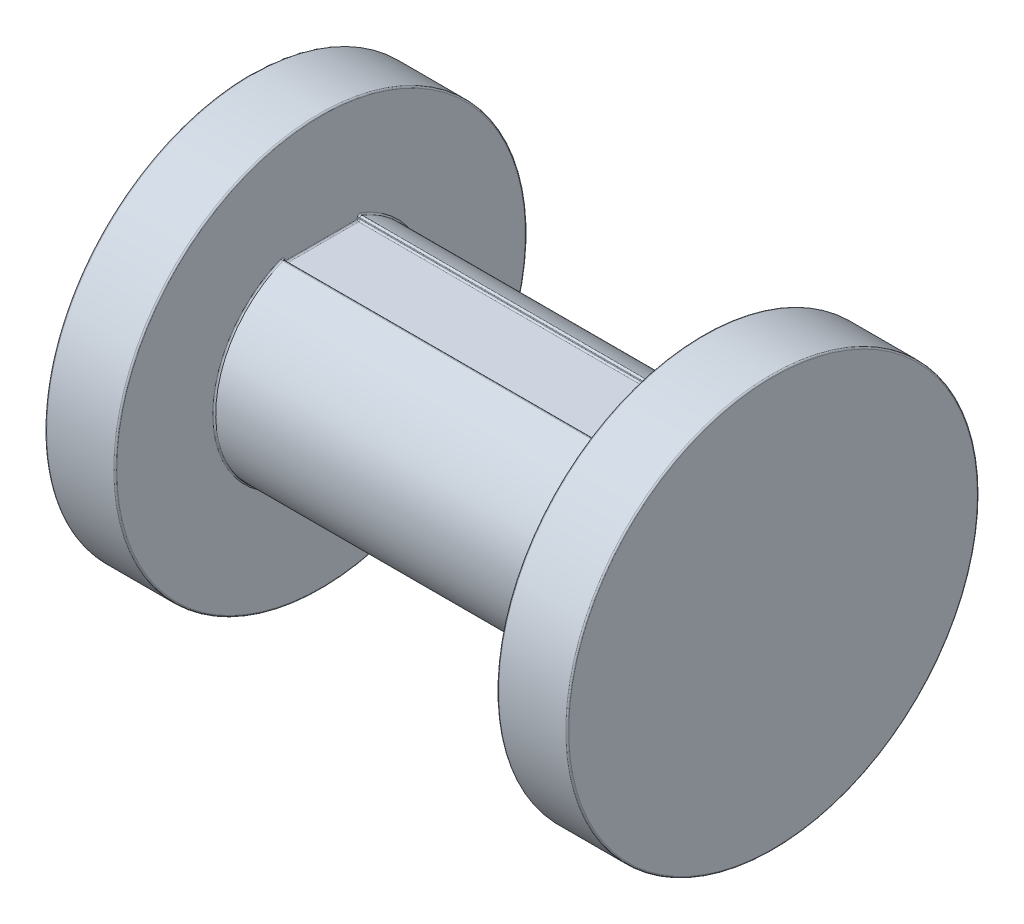
ISO-10303-21;
HEADER;
FILE_DESCRIPTION(('STEP AP214'),'2;1');
FILE_NAME('part.step','',(''),(''),'','','');
FILE_SCHEMA(('AUTOMOTIVE_DESIGN { 1 0 10303 214 1 1 1 1 }'));
ENDSEC;
DATA;
#1=APPLICATION_CONTEXT('core data for automotive mechanical design processes');
#2=APPLICATION_PROTOCOL_DEFINITION('international standard','automotive_design',2000,#1);
#3=PRODUCT_CONTEXT('',#1,'mechanical');
#4=PRODUCT('Part','Part','',(#3));
#5=PRODUCT_RELATED_PRODUCT_CATEGORY('part','',(#4));
#6=PRODUCT_DEFINITION_FORMATION('','',#4);
#7=PRODUCT_DEFINITION_CONTEXT('part definition',#1,'design');
#8=PRODUCT_DEFINITION('design','',#6,#7);
#9=PRODUCT_DEFINITION_SHAPE('','',#8);
#10=(LENGTH_UNIT() NAMED_UNIT(*) SI_UNIT(.MILLI.,.METRE.));
#11=(NAMED_UNIT(*) PLANE_ANGLE_UNIT() SI_UNIT($,.RADIAN.));
#12=(NAMED_UNIT(*) SI_UNIT($,.STERADIAN.) SOLID_ANGLE_UNIT());
#13=UNCERTAINTY_MEASURE_WITH_UNIT(LENGTH_MEASURE(1.E-05),#10,'distance_accuracy_value','');
#14=(GEOMETRIC_REPRESENTATION_CONTEXT(3) GLOBAL_UNCERTAINTY_ASSIGNED_CONTEXT((#13)) GLOBAL_UNIT_ASSIGNED_CONTEXT((#10,
#11,#12)) REPRESENTATION_CONTEXT('',''));
#15=CARTESIAN_POINT('',(0.,0.,0.));
#16=DIRECTION('',(0.,0.,1.));
#17=DIRECTION('',(1.,0.,0.));
#18=AXIS2_PLACEMENT_3D('',#15,#16,#17);
#19=CARTESIAN_POINT('',(53.02,0.,0.));
#20=DIRECTION('',(-1.,0.,0.));
#21=DIRECTION('',(0.,0.,1.));
#22=AXIS2_PLACEMENT_3D('',#19,#20,#21);
#23=CYLINDRICAL_SURFACE('',#22,21.7);
#24=DIRECTION('',(-1.,0.,0.));
#25=VECTOR('',#24,1.);
#26=CARTESIAN_POINT('',(53.02,20.1551386397743,-8.04116822429906));
#27=LINE('',#26,#25);
#28=CARTESIAN_POINT('',(-38.48,20.1551386397743,-8.04116822429907));
#29=VERTEX_POINT('',#28);
#30=CARTESIAN_POINT('',(38.48,20.1551386397743,-8.04116822429907));
#31=VERTEX_POINT('',#30);
#32=EDGE_CURVE('E68',#29,#31,#27,.F.);
#33=ORIENTED_EDGE('',*,*,#32,.T.);
#34=CARTESIAN_POINT('',(38.48,0.,0.));
#35=DIRECTION('',(1.,0.,0.));
#36=DIRECTION('',(0.,0.,-1.));
#37=AXIS2_PLACEMENT_3D('',#34,#35,#36);
#38=CIRCLE('',#37,21.7);
#39=CARTESIAN_POINT('',(38.48,20.1551386397743,8.04116822429907));
#40=VERTEX_POINT('',#39);
#41=EDGE_CURVE('E63',#31,#40,#38,.F.);
#42=ORIENTED_EDGE('',*,*,#41,.T.);
#43=DIRECTION('',(-1.,0.,0.));
#44=VECTOR('',#43,1.);
#45=CARTESIAN_POINT('',(53.02,20.1551386397743,8.04116822429906));
#46=LINE('',#45,#44);
#47=CARTESIAN_POINT('',(-38.48,20.1551386397743,8.04116822429907));
#48=VERTEX_POINT('',#47);
#49=EDGE_CURVE('E259',#40,#48,#46,.T.);
#50=ORIENTED_EDGE('',*,*,#49,.T.);
#51=CARTESIAN_POINT('',(-38.48,0.,0.));
#52=DIRECTION('',(-1.,0.,0.));
#53=DIRECTION('',(0.,0.,1.));
#54=AXIS2_PLACEMENT_3D('',#51,#52,#53);
#55=CIRCLE('',#54,21.7);
#56=EDGE_CURVE('E254',#48,#29,#55,.F.);
#57=ORIENTED_EDGE('',*,*,#56,.T.);
#58=EDGE_LOOP('',(#33,#42,#50,#57));
#59=FACE_BOUND('',#58,.T.);
#60=ADVANCED_FACE('F45',(#59),#23,.T.);
#61=CARTESIAN_POINT('',(-53.02,19.3463818513003,-7.63));
#62=DIRECTION('',(0.,0.,-1.));
#63=DIRECTION('',(-1.,0.,0.));
#64=AXIS2_PLACEMENT_3D('',#61,#62,#63);
#65=PLANE('',#64);
#66=DIRECTION('',(0.,-1.,0.));
#67=VECTOR('',#66,1.);
#68=CARTESIAN_POINT('',(38.48,20.3143569920389,-7.63));
#69=LINE('',#68,#67);
#70=CARTESIAN_POINT('',(38.48,19.6463818513003,-7.63));
#71=VERTEX_POINT('',#70);
#72=CARTESIAN_POINT('',(38.48,19.8764961701,-7.63));
#73=VERTEX_POINT('',#72);
#74=EDGE_CURVE('E196',#71,#73,#69,.F.);
#75=ORIENTED_EDGE('',*,*,#74,.T.);
#76=DIRECTION('',(-1.,0.,0.));
#77=VECTOR('',#76,1.);
#78=CARTESIAN_POINT('',(-53.02,19.8764961701,-7.63));
#79=LINE('',#78,#77);
#80=CARTESIAN_POINT('',(-38.48,19.8764961701,-7.63));
#81=VERTEX_POINT('',#80);
#82=EDGE_CURVE('E200',#73,#81,#79,.T.);
#83=ORIENTED_EDGE('',*,*,#82,.T.);
#84=DIRECTION('',(0.,1.,0.));
#85=VECTOR('',#84,1.);
#86=CARTESIAN_POINT('',(-38.48,19.3463818513003,-7.63));
#87=LINE('',#86,#85);
#88=CARTESIAN_POINT('',(-38.48,19.6463818513003,-7.63));
#89=VERTEX_POINT('',#88);
#90=EDGE_CURVE('E193',#81,#89,#87,.F.);
#91=ORIENTED_EDGE('',*,*,#90,.T.);
#92=DIRECTION('',(1.,0.,0.));
#93=VECTOR('',#92,1.);
#94=CARTESIAN_POINT('',(38.78,19.6463818513003,-7.63));
#95=LINE('',#94,#93);
#96=EDGE_CURVE('E185',#89,#71,#95,.T.);
#97=ORIENTED_EDGE('',*,*,#96,.T.);
#98=EDGE_LOOP('',(#75,#83,#91,#97));
#99=FACE_BOUND('',#98,.T.);
#100=ADVANCED_FACE('F409',(#99),#65,.F.);
#101=CARTESIAN_POINT('',(-53.02,19.3463818513003,7.63));
#102=DIRECTION('',(0.,-1.,0.));
#103=DIRECTION('',(0.,0.,-1.));
#104=AXIS2_PLACEMENT_3D('',#101,#102,#103);
#105=PLANE('',#104);
#106=DIRECTION('',(1.,0.,0.));
#107=VECTOR('',#106,1.);
#108=CARTESIAN_POINT('',(-38.78,19.3463818513003,-7.33));
#109=LINE('',#108,#107);
#110=CARTESIAN_POINT('',(38.48,19.3463818513003,-7.33));
#111=VERTEX_POINT('',#110);
#112=CARTESIAN_POINT('',(-38.48,19.3463818513003,-7.33));
#113=VERTEX_POINT('',#112);
#114=EDGE_CURVE('E244',#111,#113,#109,.F.);
#115=ORIENTED_EDGE('',*,*,#114,.T.);
#116=DIRECTION('',(0.,0.,-1.));
#117=VECTOR('',#116,1.);
#118=CARTESIAN_POINT('',(-38.48,19.3463818513003,7.63));
#119=LINE('',#118,#117);
#120=CARTESIAN_POINT('',(-38.48,19.3463818513003,7.33));
#121=VERTEX_POINT('',#120);
#122=EDGE_CURVE('E250',#113,#121,#119,.F.);
#123=ORIENTED_EDGE('',*,*,#122,.T.);
#124=DIRECTION('',(1.,0.,0.));
#125=VECTOR('',#124,1.);
#126=CARTESIAN_POINT('',(38.78,19.3463818513003,7.33));
#127=LINE('',#126,#125);
#128=CARTESIAN_POINT('',(38.48,19.3463818513003,7.33));
#129=VERTEX_POINT('',#128);
#130=EDGE_CURVE('E247',#121,#129,#127,.T.);
#131=ORIENTED_EDGE('',*,*,#130,.T.);
#132=DIRECTION('',(0.,0.,1.));
#133=VECTOR('',#132,1.);
#134=CARTESIAN_POINT('',(38.48,19.3463818513003,-7.63));
#135=LINE('',#134,#133);
#136=EDGE_CURVE('E241',#129,#111,#135,.F.);
#137=ORIENTED_EDGE('',*,*,#136,.T.);
#138=EDGE_LOOP('',(#115,#123,#131,#137));
#139=FACE_BOUND('',#138,.T.);
#140=ADVANCED_FACE('F451',(#139),#105,.F.);
#141=CARTESIAN_POINT('',(-53.02,20.3143569920389,7.63));
#142=DIRECTION('',(0.,0.,1.));
#143=DIRECTION('',(1.,0.,0.));
#144=AXIS2_PLACEMENT_3D('',#141,#142,#143);
#145=PLANE('',#144);
#146=DIRECTION('',(0.,1.,0.));
#147=VECTOR('',#146,1.);
#148=CARTESIAN_POINT('',(38.48,19.3463818513003,7.63));
#149=LINE('',#148,#147);
#150=CARTESIAN_POINT('',(38.48,19.8764961701,7.63));
#151=VERTEX_POINT('',#150);
#152=CARTESIAN_POINT('',(38.48,19.6463818513003,7.63));
#153=VERTEX_POINT('',#152);
#154=EDGE_CURVE('E209',#151,#153,#149,.F.);
#155=ORIENTED_EDGE('',*,*,#154,.T.);
#156=DIRECTION('',(1.,0.,0.));
#157=VECTOR('',#156,1.);
#158=CARTESIAN_POINT('',(-38.78,19.6463818513003,7.63));
#159=LINE('',#158,#157);
#160=CARTESIAN_POINT('',(-38.48,19.6463818513003,7.63));
#161=VERTEX_POINT('',#160);
#162=EDGE_CURVE('E213',#153,#161,#159,.F.);
#163=ORIENTED_EDGE('',*,*,#162,.T.);
#164=DIRECTION('',(0.,-1.,0.));
#165=VECTOR('',#164,1.);
#166=CARTESIAN_POINT('',(-38.48,20.3143569920389,7.63));
#167=LINE('',#166,#165);
#168=CARTESIAN_POINT('',(-38.48,19.8764961701,7.63));
#169=VERTEX_POINT('',#168);
#170=EDGE_CURVE('E206',#161,#169,#167,.F.);
#171=ORIENTED_EDGE('',*,*,#170,.T.);
#172=DIRECTION('',(-1.,0.,0.));
#173=VECTOR('',#172,1.);
#174=CARTESIAN_POINT('',(-53.02,19.8764961701,7.63));
#175=LINE('',#174,#173);
#176=EDGE_CURVE('E203',#169,#151,#175,.F.);
#177=ORIENTED_EDGE('',*,*,#176,.T.);
#178=EDGE_LOOP('',(#155,#163,#171,#177));
#179=FACE_BOUND('',#178,.T.);
#180=ADVANCED_FACE('F425',(#179),#145,.F.);
#181=CARTESIAN_POINT('',(38.78,0.,0.));
#182=DIRECTION('',(1.,0.,0.));
#183=DIRECTION('',(0.,0.,-1.));
#184=AXIS2_PLACEMENT_3D('',#181,#182,#183);
#185=PLANE('',#184);
#186=DIRECTION('',(0.,-1.,0.));
#187=VECTOR('',#186,1.);
#188=CARTESIAN_POINT('',(38.78,19.3463818513003,-7.33));
#189=LINE('',#188,#187);
#190=CARTESIAN_POINT('',(38.78,19.8764961701,-7.33));
#191=VERTEX_POINT('',#190);
#192=CARTESIAN_POINT('',(38.78,19.6463818513003,-7.33));
#193=VERTEX_POINT('',#192);
#194=EDGE_CURVE('E153',#191,#193,#189,.T.);
#195=ORIENTED_EDGE('',*,*,#194,.T.);
#196=DIRECTION('',(0.,0.,1.));
#197=VECTOR('',#196,1.);
#198=CARTESIAN_POINT('',(38.78,19.6463818513003,7.63));
#199=LINE('',#198,#197);
#200=CARTESIAN_POINT('',(38.78,19.6463818513003,7.33));
#201=VERTEX_POINT('',#200);
#202=EDGE_CURVE('E178',#193,#201,#199,.T.);
#203=ORIENTED_EDGE('',*,*,#202,.T.);
#204=DIRECTION('',(0.,1.,0.));
#205=VECTOR('',#204,1.);
#206=CARTESIAN_POINT('',(38.78,20.3143569920389,7.33));
#207=LINE('',#206,#205);
#208=CARTESIAN_POINT('',(38.78,19.8764961701,7.33));
#209=VERTEX_POINT('',#208);
#210=EDGE_CURVE('E179',#201,#209,#207,.T.);
#211=ORIENTED_EDGE('',*,*,#210,.T.);
#212=CARTESIAN_POINT('',(38.78,19.8764961701,7.93));
#213=DIRECTION('',(1.,0.,0.));
#214=DIRECTION('',(0.,0.,-1.));
#215=AXIS2_PLACEMENT_3D('',#212,#213,#214);
#216=CIRCLE('',#215,0.6);
#217=CARTESIAN_POINT('',(38.78,20.4337811094486,8.15233644859813));
#218=VERTEX_POINT('',#217);
#219=EDGE_CURVE('E187',#218,#209,#216,.F.);
#220=ORIENTED_EDGE('',*,*,#219,.F.);
#221=CARTESIAN_POINT('',(38.78,0.,0.));
#222=DIRECTION('',(1.,0.,0.));
#223=DIRECTION('',(0.,0.,-1.));
#224=AXIS2_PLACEMENT_3D('',#221,#222,#223);
#225=CIRCLE('',#224,22.);
#226=CARTESIAN_POINT('',(38.78,20.4337811094486,-8.15233644859813));
#227=VERTEX_POINT('',#226);
#228=EDGE_CURVE('E155',#218,#227,#225,.T.);
#229=ORIENTED_EDGE('',*,*,#228,.T.);
#230=CARTESIAN_POINT('',(38.78,19.8764961701,-7.93));
#231=DIRECTION('',(1.,0.,0.));
#232=DIRECTION('',(0.,0.,-1.));
#233=AXIS2_PLACEMENT_3D('',#230,#231,#232);
#234=CIRCLE('',#233,0.6);
#235=EDGE_CURVE('E148',#191,#227,#234,.F.);
#236=ORIENTED_EDGE('',*,*,#235,.F.);
#237=EDGE_LOOP('',(#195,#203,#211,#220,#229,#236));
#238=FACE_BOUND('',#237,.T.);
#239=CARTESIAN_POINT('',(38.78,0.,0.));
#240=DIRECTION('',(1.,0.,0.));
#241=DIRECTION('',(0.,0.,-1.));
#242=AXIS2_PLACEMENT_3D('',#239,#240,#241);
#243=CIRCLE('',#242,41.5);
#244=CARTESIAN_POINT('',(38.78,0.,-41.5));
#245=VERTEX_POINT('',#244);
#246=EDGE_CURVE('E160',#245,#245,#243,.F.);
#247=ORIENTED_EDGE('',*,*,#246,.T.);
#248=EDGE_LOOP('',(#247));
#249=FACE_BOUND('',#248,.T.);
#250=ADVANCED_FACE('F150',(#238,#249),#185,.F.);
#251=CARTESIAN_POINT('',(38.78,0.,0.));
#252=DIRECTION('',(1.,0.,0.));
#253=DIRECTION('',(0.,0.,-1.));
#254=AXIS2_PLACEMENT_3D('',#251,#252,#253);
#255=CYLINDRICAL_SURFACE('',#254,41.8);
#256=CARTESIAN_POINT('',(39.08,0.,0.));
#257=DIRECTION('',(1.,0.,0.));
#258=DIRECTION('',(0.,0.,-1.));
#259=AXIS2_PLACEMENT_3D('',#256,#257,#258);
#260=CIRCLE('',#259,41.8);
#261=CARTESIAN_POINT('',(39.08,0.,-41.8));
#262=VERTEX_POINT('',#261);
#263=EDGE_CURVE('E268',#262,#262,#260,.T.);
#264=ORIENTED_EDGE('',*,*,#263,.T.);
#265=EDGE_LOOP('',(#264));
#266=FACE_BOUND('',#265,.T.);
#267=CARTESIAN_POINT('',(52.72,0.,0.));
#268=DIRECTION('',(1.,0.,0.));
#269=DIRECTION('',(0.,0.,-1.));
#270=AXIS2_PLACEMENT_3D('',#267,#268,#269);
#271=CIRCLE('',#270,41.8);
#272=CARTESIAN_POINT('',(52.72,0.,-41.8));
#273=VERTEX_POINT('',#272);
#274=EDGE_CURVE('E264',#273,#273,#271,.F.);
#275=ORIENTED_EDGE('',*,*,#274,.T.);
#276=EDGE_LOOP('',(#275));
#277=FACE_BOUND('',#276,.T.);
#278=ADVANCED_FACE('F782',(#266,#277),#255,.T.);
#279=CARTESIAN_POINT('',(53.02,0.,0.));
#280=DIRECTION('',(1.,0.,0.));
#281=DIRECTION('',(0.,0.,-1.));
#282=AXIS2_PLACEMENT_3D('',#279,#280,#281);
#283=PLANE('',#282);
#284=CARTESIAN_POINT('',(53.02,0.,0.));
#285=DIRECTION('',(1.,0.,0.));
#286=DIRECTION('',(0.,0.,-1.));
#287=AXIS2_PLACEMENT_3D('',#284,#285,#286);
#288=CIRCLE('',#287,41.5);
#289=CARTESIAN_POINT('',(53.02,0.,-41.5));
#290=VERTEX_POINT('',#289);
#291=EDGE_CURVE('E272',#290,#290,#288,.T.);
#292=ORIENTED_EDGE('',*,*,#291,.T.);
#293=EDGE_LOOP('',(#292));
#294=FACE_BOUND('',#293,.T.);
#295=ADVANCED_FACE('F739',(#294),#283,.T.);
#296=CARTESIAN_POINT('',(-38.78,0.,0.));
#297=DIRECTION('',(-1.,0.,0.));
#298=DIRECTION('',(0.,0.,-1.));
#299=AXIS2_PLACEMENT_3D('',#296,#297,#298);
#300=PLANE('',#299);
#301=CARTESIAN_POINT('',(-38.78,0.,0.));
#302=DIRECTION('',(-1.,0.,0.));
#303=DIRECTION('',(0.,0.,1.));
#304=AXIS2_PLACEMENT_3D('',#301,#302,#303);
#305=CIRCLE('',#304,41.5);
#306=CARTESIAN_POINT('',(-38.78,0.,41.5));
#307=VERTEX_POINT('',#306);
#308=EDGE_CURVE('E237',#307,#307,#305,.F.);
#309=ORIENTED_EDGE('',*,*,#308,.T.);
#310=EDGE_LOOP('',(#309));
#311=FACE_BOUND('',#310,.T.);
#312=DIRECTION('',(0.,-1.,0.));
#313=VECTOR('',#312,1.);
#314=CARTESIAN_POINT('',(-38.78,19.3463818513003,7.33));
#315=LINE('',#314,#313);
#316=CARTESIAN_POINT('',(-38.78,19.8764961701,7.33));
#317=VERTEX_POINT('',#316);
#318=CARTESIAN_POINT('',(-38.78,19.6463818513003,7.33));
#319=VERTEX_POINT('',#318);
#320=EDGE_CURVE('E230',#317,#319,#315,.T.);
#321=ORIENTED_EDGE('',*,*,#320,.T.);
#322=DIRECTION('',(0.,0.,-1.));
#323=VECTOR('',#322,1.);
#324=CARTESIAN_POINT('',(-38.78,19.6463818513003,-7.63));
#325=LINE('',#324,#323);
#326=CARTESIAN_POINT('',(-38.78,19.6463818513003,-7.33));
#327=VERTEX_POINT('',#326);
#328=EDGE_CURVE('E234',#319,#327,#325,.T.);
#329=ORIENTED_EDGE('',*,*,#328,.T.);
#330=DIRECTION('',(0.,1.,0.));
#331=VECTOR('',#330,1.);
#332=CARTESIAN_POINT('',(-38.78,20.3143569920389,-7.33));
#333=LINE('',#332,#331);
#334=CARTESIAN_POINT('',(-38.78,19.8764961701,-7.33));
#335=VERTEX_POINT('',#334);
#336=EDGE_CURVE('E227',#327,#335,#333,.T.);
#337=ORIENTED_EDGE('',*,*,#336,.T.);
#338=CARTESIAN_POINT('',(-38.78,19.8764961701,-7.93));
#339=DIRECTION('',(-1.,0.,0.));
#340=DIRECTION('',(0.,0.,1.));
#341=AXIS2_PLACEMENT_3D('',#338,#339,#340);
#342=CIRCLE('',#341,0.6);
#343=CARTESIAN_POINT('',(-38.78,20.4337811094486,-8.15233644859813));
#344=VERTEX_POINT('',#343);
#345=EDGE_CURVE('E223',#344,#335,#342,.F.);
#346=ORIENTED_EDGE('',*,*,#345,.F.);
#347=CARTESIAN_POINT('',(-38.78,0.,0.));
#348=DIRECTION('',(-1.,0.,0.));
#349=DIRECTION('',(0.,0.,1.));
#350=AXIS2_PLACEMENT_3D('',#347,#348,#349);
#351=CIRCLE('',#350,22.);
#352=CARTESIAN_POINT('',(-38.78,20.4337811094486,8.15233644859813));
#353=VERTEX_POINT('',#352);
#354=EDGE_CURVE('E220',#344,#353,#351,.T.);
#355=ORIENTED_EDGE('',*,*,#354,.T.);
#356=CARTESIAN_POINT('',(-38.78,19.8764961701,7.93));
#357=DIRECTION('',(-1.,0.,0.));
#358=DIRECTION('',(0.,0.,1.));
#359=AXIS2_PLACEMENT_3D('',#356,#357,#358);
#360=CIRCLE('',#359,0.6);
#361=EDGE_CURVE('E216',#317,#353,#360,.F.);
#362=ORIENTED_EDGE('',*,*,#361,.F.);
#363=EDGE_LOOP('',(#321,#329,#337,#346,#355,#362));
#364=FACE_BOUND('',#363,.T.);
#365=ADVANCED_FACE('F728',(#311,#364),#300,.F.);
#366=CARTESIAN_POINT('',(-38.78,0.,0.));
#367=DIRECTION('',(-1.,0.,0.));
#368=DIRECTION('',(0.,0.,1.));
#369=AXIS2_PLACEMENT_3D('',#366,#367,#368);
#370=CYLINDRICAL_SURFACE('',#369,41.8);
#371=CARTESIAN_POINT('',(-52.72,0.,0.));
#372=DIRECTION('',(1.,0.,0.));
#373=DIRECTION('',(0.,0.,-1.));
#374=AXIS2_PLACEMENT_3D('',#371,#372,#373);
#375=CIRCLE('',#374,41.8);
#376=CARTESIAN_POINT('',(-52.72,0.,-41.8));
#377=VERTEX_POINT('',#376);
#378=EDGE_CURVE('E55',#377,#377,#375,.T.);
#379=ORIENTED_EDGE('',*,*,#378,.T.);
#380=EDGE_LOOP('',(#379));
#381=FACE_BOUND('',#380,.T.);
#382=CARTESIAN_POINT('',(-39.08,0.,0.));
#383=DIRECTION('',(-1.,0.,0.));
#384=DIRECTION('',(0.,0.,1.));
#385=AXIS2_PLACEMENT_3D('',#382,#383,#384);
#386=CIRCLE('',#385,41.8);
#387=CARTESIAN_POINT('',(-39.08,0.,41.8));
#388=VERTEX_POINT('',#387);
#389=EDGE_CURVE('E276',#388,#388,#386,.T.);
#390=ORIENTED_EDGE('',*,*,#389,.T.);
#391=EDGE_LOOP('',(#390));
#392=FACE_BOUND('',#391,.T.);
#393=ADVANCED_FACE('F715',(#381,#392),#370,.T.);
#394=CARTESIAN_POINT('',(-53.02,0.,0.));
#395=DIRECTION('',(1.,0.,0.));
#396=DIRECTION('',(0.,0.,-1.));
#397=AXIS2_PLACEMENT_3D('',#394,#395,#396);
#398=PLANE('',#397);
#399=CARTESIAN_POINT('',(-53.02,0.,0.));
#400=DIRECTION('',(1.,0.,0.));
#401=DIRECTION('',(0.,0.,-1.));
#402=AXIS2_PLACEMENT_3D('',#399,#400,#401);
#403=CIRCLE('',#402,41.5);
#404=CARTESIAN_POINT('',(-53.02,0.,-41.5));
#405=VERTEX_POINT('',#404);
#406=EDGE_CURVE('E11',#405,#405,#403,.F.);
#407=ORIENTED_EDGE('',*,*,#406,.T.);
#408=EDGE_LOOP('',(#407));
#409=FACE_BOUND('',#408,.T.);
#410=ADVANCED_FACE('F471',(#409),#398,.F.);
#411=CARTESIAN_POINT('',(-38.48,0.,7.33));
#412=DIRECTION('',(0.,1.,0.));
#413=DIRECTION('',(0.,0.,1.));
#414=AXIS2_PLACEMENT_3D('',#411,#412,#413);
#415=CYLINDRICAL_SURFACE('',#414,0.3);
#416=CARTESIAN_POINT('',(-38.48,19.6463818513003,7.33));
#417=DIRECTION('',(0.,1.,0.));
#418=DIRECTION('',(0.,0.,1.));
#419=AXIS2_PLACEMENT_3D('',#416,#417,#418);
#420=CIRCLE('',#419,0.3);
#421=EDGE_CURVE('E358',#319,#161,#420,.T.);
#422=ORIENTED_EDGE('',*,*,#421,.F.);
#423=ORIENTED_EDGE('',*,*,#320,.F.);
#424=CARTESIAN_POINT('',(-38.48,19.8764961701,7.33));
#425=DIRECTION('',(0.,-1.,0.));
#426=DIRECTION('',(0.,0.,-1.));
#427=AXIS2_PLACEMENT_3D('',#424,#425,#426);
#428=CIRCLE('',#427,0.3);
#429=EDGE_CURVE('E49',#169,#317,#428,.T.);
#430=ORIENTED_EDGE('',*,*,#429,.F.);
#431=ORIENTED_EDGE('',*,*,#170,.F.);
#432=EDGE_LOOP('',(#422,#423,#430,#431));
#433=FACE_BOUND('',#432,.T.);
#434=ADVANCED_FACE('F427',(#433),#415,.F.);
#435=CARTESIAN_POINT('',(-38.48,19.8764961701,7.93));
#436=DIRECTION('',(-1.,0.,0.));
#437=DIRECTION('',(0.,0.,1.));
#438=AXIS2_PLACEMENT_3D('',#435,#436,#437);
#439=TOROIDAL_SURFACE('',#438,0.6,0.3);
#440=ORIENTED_EDGE('',*,*,#429,.T.);
#441=ORIENTED_EDGE('',*,*,#361,.T.);
#442=CARTESIAN_POINT('',(-38.48,20.4337811094486,8.15233644859813));
#443=DIRECTION('',(0.,-0.370560747663552,0.928808232247663));
#444=DIRECTION('',(0.,-0.928808232247663,-0.370560747663552));
#445=AXIS2_PLACEMENT_3D('',#442,#443,#444);
#446=CIRCLE('',#445,0.3);
#447=EDGE_CURVE('E355',#48,#353,#446,.F.);
#448=ORIENTED_EDGE('',*,*,#447,.F.);
#449=CARTESIAN_POINT('',(-38.48,19.8764961701,7.93));
#450=DIRECTION('',(-1.,0.,0.));
#451=DIRECTION('',(0.,0.,1.));
#452=AXIS2_PLACEMENT_3D('',#449,#450,#451);
#453=CIRCLE('',#452,0.3);
#454=EDGE_CURVE('E351',#169,#48,#453,.F.);
#455=ORIENTED_EDGE('',*,*,#454,.F.);
#456=EDGE_LOOP('',(#440,#441,#448,#455));
#457=FACE_BOUND('',#456,.T.);
#458=ADVANCED_FACE('F430',(#457),#439,.F.);
#459=CARTESIAN_POINT('',(-38.48,19.6463818513003,7.33));
#460=DIRECTION('',(0.,0.,1.));
#461=DIRECTION('',(1.,0.,0.));
#462=AXIS2_PLACEMENT_3D('',#459,#460,#461);
#463=SPHERICAL_SURFACE('',#462,0.3);
#464=CARTESIAN_POINT('',(-38.48,19.6463818513003,7.33));
#465=DIRECTION('',(0.,0.,-1.));
#466=DIRECTION('',(-1.,0.,0.));
#467=AXIS2_PLACEMENT_3D('',#464,#465,#466);
#468=CIRCLE('',#467,0.3);
#469=EDGE_CURVE('E343',#319,#121,#468,.F.);
#470=ORIENTED_EDGE('',*,*,#469,.F.);
#471=ORIENTED_EDGE('',*,*,#421,.T.);
#472=CARTESIAN_POINT('',(-38.48,19.6463818513003,7.33));
#473=DIRECTION('',(1.,0.,0.));
#474=DIRECTION('',(0.,0.,-1.));
#475=AXIS2_PLACEMENT_3D('',#472,#473,#474);
#476=CIRCLE('',#475,0.3);
#477=EDGE_CURVE('E347',#121,#161,#476,.F.);
#478=ORIENTED_EDGE('',*,*,#477,.F.);
#479=EDGE_LOOP('',(#470,#471,#478));
#480=FACE_BOUND('',#479,.T.);
#481=ADVANCED_FACE('F454',(#480),#463,.F.);
#482=CARTESIAN_POINT('',(-38.48,0.,0.));
#483=DIRECTION('',(-1.,0.,0.));
#484=DIRECTION('',(0.,0.,1.));
#485=AXIS2_PLACEMENT_3D('',#482,#483,#484);
#486=TOROIDAL_SURFACE('',#485,22.,0.3);
#487=ORIENTED_EDGE('',*,*,#447,.T.);
#488=ORIENTED_EDGE('',*,*,#354,.F.);
#489=CARTESIAN_POINT('',(-38.48,20.4337811094486,-8.15233644859813));
#490=DIRECTION('',(0.,-0.370560747663552,-0.928808232247663));
#491=DIRECTION('',(0.,0.928808232247663,-0.370560747663552));
#492=AXIS2_PLACEMENT_3D('',#489,#490,#491);
#493=CIRCLE('',#492,0.3);
#494=EDGE_CURVE('E335',#29,#344,#493,.T.);
#495=ORIENTED_EDGE('',*,*,#494,.F.);
#496=ORIENTED_EDGE('',*,*,#56,.F.);
#497=EDGE_LOOP('',(#487,#488,#495,#496));
#498=FACE_BOUND('',#497,.T.);
#499=ADVANCED_FACE('F434',(#498),#486,.F.);
#500=CARTESIAN_POINT('',(53.02,19.8764961701,7.93));
#501=DIRECTION('',(-1.,0.,0.));
#502=DIRECTION('',(0.,0.,1.));
#503=AXIS2_PLACEMENT_3D('',#500,#501,#502);
#504=CYLINDRICAL_SURFACE('',#503,0.3);
#505=ORIENTED_EDGE('',*,*,#454,.T.);
#506=ORIENTED_EDGE('',*,*,#49,.F.);
#507=CARTESIAN_POINT('',(38.48,19.8764961701,7.93));
#508=DIRECTION('',(1.,0.,0.));
#509=DIRECTION('',(0.,0.,-1.));
#510=AXIS2_PLACEMENT_3D('',#507,#508,#509);
#511=CIRCLE('',#510,0.3);
#512=EDGE_CURVE('E331',#151,#40,#511,.T.);
#513=ORIENTED_EDGE('',*,*,#512,.F.);
#514=ORIENTED_EDGE('',*,*,#176,.F.);
#515=EDGE_LOOP('',(#505,#506,#513,#514));
#516=FACE_BOUND('',#515,.T.);
#517=ADVANCED_FACE('F401',(#516),#504,.T.);
#518=CARTESIAN_POINT('',(38.48,0.,7.33));
#519=DIRECTION('',(0.,-1.,0.));
#520=DIRECTION('',(0.,0.,-1.));
#521=AXIS2_PLACEMENT_3D('',#518,#519,#520);
#522=CYLINDRICAL_SURFACE('',#521,0.3);
#523=CARTESIAN_POINT('',(38.48,19.6463818513003,7.33));
#524=DIRECTION('',(0.,1.,0.));
#525=DIRECTION('',(0.,0.,1.));
#526=AXIS2_PLACEMENT_3D('',#523,#524,#525);
#527=CIRCLE('',#526,0.3);
#528=EDGE_CURVE('E323',#153,#201,#527,.T.);
#529=ORIENTED_EDGE('',*,*,#528,.F.);
#530=ORIENTED_EDGE('',*,*,#154,.F.);
#531=CARTESIAN_POINT('',(38.48,19.8764961701,7.33));
#532=DIRECTION('',(0.,-1.,0.));
#533=DIRECTION('',(0.,0.,-1.));
#534=AXIS2_PLACEMENT_3D('',#531,#532,#533);
#535=CIRCLE('',#534,0.3);
#536=EDGE_CURVE('E327',#209,#151,#535,.T.);
#537=ORIENTED_EDGE('',*,*,#536,.F.);
#538=ORIENTED_EDGE('',*,*,#210,.F.);
#539=EDGE_LOOP('',(#529,#530,#537,#538));
#540=FACE_BOUND('',#539,.T.);
#541=ADVANCED_FACE('F395',(#540),#522,.F.);
#542=CARTESIAN_POINT('',(-53.02,19.6463818513003,7.33));
#543=DIRECTION('',(-1.,0.,0.));
#544=DIRECTION('',(0.,0.,1.));
#545=AXIS2_PLACEMENT_3D('',#542,#543,#544);
#546=CYLINDRICAL_SURFACE('',#545,0.3);
#547=ORIENTED_EDGE('',*,*,#477,.T.);
#548=ORIENTED_EDGE('',*,*,#162,.F.);
#549=CARTESIAN_POINT('',(38.48,19.6463818513003,7.33));
#550=DIRECTION('',(-1.,0.,0.));
#551=DIRECTION('',(0.,0.,1.));
#552=AXIS2_PLACEMENT_3D('',#549,#550,#551);
#553=CIRCLE('',#552,0.3);
#554=EDGE_CURVE('E320',#129,#153,#553,.T.);
#555=ORIENTED_EDGE('',*,*,#554,.F.);
#556=ORIENTED_EDGE('',*,*,#130,.F.);
#557=EDGE_LOOP('',(#547,#548,#555,#556));
#558=FACE_BOUND('',#557,.T.);
#559=ADVANCED_FACE('F423',(#558),#546,.F.);
#560=CARTESIAN_POINT('',(-38.48,19.6463818513003,0.));
#561=DIRECTION('',(0.,0.,1.));
#562=DIRECTION('',(1.,0.,0.));
#563=AXIS2_PLACEMENT_3D('',#560,#561,#562);
#564=CYLINDRICAL_SURFACE('',#563,0.3);
#565=ORIENTED_EDGE('',*,*,#469,.T.);
#566=ORIENTED_EDGE('',*,*,#122,.F.);
#567=CARTESIAN_POINT('',(-38.48,19.6463818513003,-7.33));
#568=DIRECTION('',(0.,0.,1.));
#569=DIRECTION('',(1.,0.,0.));
#570=AXIS2_PLACEMENT_3D('',#567,#568,#569);
#571=CIRCLE('',#570,0.3);
#572=EDGE_CURVE('E316',#327,#113,#571,.T.);
#573=ORIENTED_EDGE('',*,*,#572,.F.);
#574=ORIENTED_EDGE('',*,*,#328,.F.);
#575=EDGE_LOOP('',(#565,#566,#573,#574));
#576=FACE_BOUND('',#575,.T.);
#577=ADVANCED_FACE('F453',(#576),#564,.F.);
#578=CARTESIAN_POINT('',(-38.48,0.,-7.33));
#579=DIRECTION('',(0.,-1.,0.));
#580=DIRECTION('',(0.,0.,-1.));
#581=AXIS2_PLACEMENT_3D('',#578,#579,#580);
#582=CYLINDRICAL_SURFACE('',#581,0.3);
#583=CARTESIAN_POINT('',(-38.48,19.8764961701,-7.33));
#584=DIRECTION('',(0.,-1.,0.));
#585=DIRECTION('',(0.,0.,-1.));
#586=AXIS2_PLACEMENT_3D('',#583,#584,#585);
#587=CIRCLE('',#586,0.3);
#588=EDGE_CURVE('E339',#335,#81,#587,.T.);
#589=ORIENTED_EDGE('',*,*,#588,.F.);
#590=ORIENTED_EDGE('',*,*,#336,.F.);
#591=CARTESIAN_POINT('',(-38.48,19.6463818513003,-7.33));
#592=DIRECTION('',(0.,1.,0.));
#593=DIRECTION('',(0.,0.,1.));
#594=AXIS2_PLACEMENT_3D('',#591,#592,#593);
#595=CIRCLE('',#594,0.3);
#596=EDGE_CURVE('E312',#89,#327,#595,.T.);
#597=ORIENTED_EDGE('',*,*,#596,.F.);
#598=ORIENTED_EDGE('',*,*,#90,.F.);
#599=EDGE_LOOP('',(#589,#590,#597,#598));
#600=FACE_BOUND('',#599,.T.);
#601=ADVANCED_FACE('F440',(#600),#582,.F.);
#602=CARTESIAN_POINT('',(-38.48,19.8764961701,-7.93));
#603=DIRECTION('',(-1.,0.,0.));
#604=DIRECTION('',(0.,0.,1.));
#605=AXIS2_PLACEMENT_3D('',#602,#603,#604);
#606=TOROIDAL_SURFACE('',#605,0.6,0.3);
#607=ORIENTED_EDGE('',*,*,#345,.T.);
#608=ORIENTED_EDGE('',*,*,#588,.T.);
#609=CARTESIAN_POINT('',(-38.48,19.8764961701,-7.93));
#610=DIRECTION('',(-1.,0.,0.));
#611=DIRECTION('',(0.,0.,1.));
#612=AXIS2_PLACEMENT_3D('',#609,#610,#611);
#613=CIRCLE('',#612,0.3);
#614=EDGE_CURVE('E308',#29,#81,#613,.F.);
#615=ORIENTED_EDGE('',*,*,#614,.F.);
#616=ORIENTED_EDGE('',*,*,#494,.T.);
#617=EDGE_LOOP('',(#607,#608,#615,#616));
#618=FACE_BOUND('',#617,.T.);
#619=ADVANCED_FACE('F436',(#618),#606,.F.);
#620=CARTESIAN_POINT('',(38.48,19.8764961701,7.93));
#621=DIRECTION('',(1.,0.,0.));
#622=DIRECTION('',(0.,0.,-1.));
#623=AXIS2_PLACEMENT_3D('',#620,#621,#622);
#624=TOROIDAL_SURFACE('',#623,0.6,0.3);
#625=ORIENTED_EDGE('',*,*,#536,.T.);
#626=ORIENTED_EDGE('',*,*,#512,.T.);
#627=CARTESIAN_POINT('',(38.48,20.4337811094486,8.15233644859813));
#628=DIRECTION('',(0.,-0.370560747663552,0.928808232247663));
#629=DIRECTION('',(0.,-0.928808232247663,-0.370560747663552));
#630=AXIS2_PLACEMENT_3D('',#627,#628,#629);
#631=CIRCLE('',#630,0.3);
#632=EDGE_CURVE('E304',#218,#40,#631,.F.);
#633=ORIENTED_EDGE('',*,*,#632,.F.);
#634=ORIENTED_EDGE('',*,*,#219,.T.);
#635=EDGE_LOOP('',(#625,#626,#633,#634));
#636=FACE_BOUND('',#635,.T.);
#637=ADVANCED_FACE('F388',(#636),#624,.F.);
#638=CARTESIAN_POINT('',(38.48,19.6463818513003,7.33));
#639=DIRECTION('',(0.,0.,1.));
#640=DIRECTION('',(1.,0.,0.));
#641=AXIS2_PLACEMENT_3D('',#638,#639,#640);
#642=SPHERICAL_SURFACE('',#641,0.3);
#643=ORIENTED_EDGE('',*,*,#554,.T.);
#644=ORIENTED_EDGE('',*,*,#528,.T.);
#645=CARTESIAN_POINT('',(38.48,19.6463818513003,7.33));
#646=DIRECTION('',(0.,0.,-1.));
#647=DIRECTION('',(-1.,0.,0.));
#648=AXIS2_PLACEMENT_3D('',#645,#646,#647);
#649=CIRCLE('',#648,0.3);
#650=EDGE_CURVE('E300',#129,#201,#649,.F.);
#651=ORIENTED_EDGE('',*,*,#650,.F.);
#652=EDGE_LOOP('',(#643,#644,#651));
#653=FACE_BOUND('',#652,.T.);
#654=ADVANCED_FACE('F420',(#653),#642,.F.);
#655=CARTESIAN_POINT('',(-38.48,19.6463818513003,-7.33));
#656=DIRECTION('',(-1.,0.,0.));
#657=DIRECTION('',(0.,0.,1.));
#658=AXIS2_PLACEMENT_3D('',#655,#656,#657);
#659=SPHERICAL_SURFACE('',#658,0.3);
#660=ORIENTED_EDGE('',*,*,#596,.T.);
#661=ORIENTED_EDGE('',*,*,#572,.T.);
#662=CARTESIAN_POINT('',(-38.48,19.6463818513003,-7.33));
#663=DIRECTION('',(1.,0.,0.));
#664=DIRECTION('',(0.,0.,-1.));
#665=AXIS2_PLACEMENT_3D('',#662,#663,#664);
#666=CIRCLE('',#665,0.3);
#667=EDGE_CURVE('E296',#89,#113,#666,.F.);
#668=ORIENTED_EDGE('',*,*,#667,.F.);
#669=EDGE_LOOP('',(#660,#661,#668));
#670=FACE_BOUND('',#669,.T.);
#671=ADVANCED_FACE('F445',(#670),#659,.F.);
#672=CARTESIAN_POINT('',(53.02,19.8764961701,-7.93));
#673=DIRECTION('',(-1.,0.,0.));
#674=DIRECTION('',(0.,0.,1.));
#675=AXIS2_PLACEMENT_3D('',#672,#673,#674);
#676=CYLINDRICAL_SURFACE('',#675,0.3);
#677=ORIENTED_EDGE('',*,*,#614,.T.);
#678=ORIENTED_EDGE('',*,*,#82,.F.);
#679=CARTESIAN_POINT('',(38.48,19.8764961701,-7.93));
#680=DIRECTION('',(1.,0.,0.));
#681=DIRECTION('',(0.,0.,-1.));
#682=AXIS2_PLACEMENT_3D('',#679,#680,#681);
#683=CIRCLE('',#682,0.3);
#684=EDGE_CURVE('E166',#31,#73,#683,.T.);
#685=ORIENTED_EDGE('',*,*,#684,.F.);
#686=ORIENTED_EDGE('',*,*,#32,.F.);
#687=EDGE_LOOP('',(#677,#678,#685,#686));
#688=FACE_BOUND('',#687,.T.);
#689=ADVANCED_FACE('F405',(#688),#676,.T.);
#690=CARTESIAN_POINT('',(38.48,0.,0.));
#691=DIRECTION('',(1.,0.,0.));
#692=DIRECTION('',(0.,0.,-1.));
#693=AXIS2_PLACEMENT_3D('',#690,#691,#692);
#694=TOROIDAL_SURFACE('',#693,22.,0.3);
#695=ORIENTED_EDGE('',*,*,#632,.T.);
#696=ORIENTED_EDGE('',*,*,#41,.F.);
#697=CARTESIAN_POINT('',(38.48,20.4337811094486,-8.15233644859813));
#698=DIRECTION('',(0.,-0.370560747663552,-0.928808232247663));
#699=DIRECTION('',(0.,0.928808232247663,-0.370560747663552));
#700=AXIS2_PLACEMENT_3D('',#697,#698,#699);
#701=CIRCLE('',#700,0.3);
#702=EDGE_CURVE('E291',#227,#31,#701,.T.);
#703=ORIENTED_EDGE('',*,*,#702,.F.);
#704=ORIENTED_EDGE('',*,*,#228,.F.);
#705=EDGE_LOOP('',(#695,#696,#703,#704));
#706=FACE_BOUND('',#705,.T.);
#707=ADVANCED_FACE('F403',(#706),#694,.F.);
#708=CARTESIAN_POINT('',(38.48,19.6463818513003,0.));
#709=DIRECTION('',(0.,0.,-1.));
#710=DIRECTION('',(-1.,0.,0.));
#711=AXIS2_PLACEMENT_3D('',#708,#709,#710);
#712=CYLINDRICAL_SURFACE('',#711,0.3);
#713=ORIENTED_EDGE('',*,*,#650,.T.);
#714=ORIENTED_EDGE('',*,*,#202,.F.);
#715=CARTESIAN_POINT('',(38.48,19.6463818513003,-7.33));
#716=DIRECTION('',(0.,0.,1.));
#717=DIRECTION('',(1.,0.,0.));
#718=AXIS2_PLACEMENT_3D('',#715,#716,#717);
#719=CIRCLE('',#718,0.3);
#720=EDGE_CURVE('E288',#111,#193,#719,.T.);
#721=ORIENTED_EDGE('',*,*,#720,.F.);
#722=ORIENTED_EDGE('',*,*,#136,.F.);
#723=EDGE_LOOP('',(#713,#714,#721,#722));
#724=FACE_BOUND('',#723,.T.);
#725=ADVANCED_FACE('F417',(#724),#712,.F.);
#726=CARTESIAN_POINT('',(-53.02,19.6463818513003,-7.33));
#727=DIRECTION('',(-1.,0.,0.));
#728=DIRECTION('',(0.,0.,1.));
#729=AXIS2_PLACEMENT_3D('',#726,#727,#728);
#730=CYLINDRICAL_SURFACE('',#729,0.3);
#731=ORIENTED_EDGE('',*,*,#667,.T.);
#732=ORIENTED_EDGE('',*,*,#114,.F.);
#733=CARTESIAN_POINT('',(38.48,19.6463818513003,-7.33));
#734=DIRECTION('',(-1.,0.,0.));
#735=DIRECTION('',(0.,0.,1.));
#736=AXIS2_PLACEMENT_3D('',#733,#734,#735);
#737=CIRCLE('',#736,0.3);
#738=EDGE_CURVE('E171',#71,#111,#737,.T.);
#739=ORIENTED_EDGE('',*,*,#738,.F.);
#740=ORIENTED_EDGE('',*,*,#96,.F.);
#741=EDGE_LOOP('',(#731,#732,#739,#740));
#742=FACE_BOUND('',#741,.T.);
#743=ADVANCED_FACE('F448',(#742),#730,.F.);
#744=CARTESIAN_POINT('',(38.48,19.8764961701,-7.93));
#745=DIRECTION('',(1.,0.,0.));
#746=DIRECTION('',(0.,0.,-1.));
#747=AXIS2_PLACEMENT_3D('',#744,#745,#746);
#748=TOROIDAL_SURFACE('',#747,0.6,0.3);
#749=ORIENTED_EDGE('',*,*,#702,.T.);
#750=ORIENTED_EDGE('',*,*,#684,.T.);
#751=CARTESIAN_POINT('',(38.48,19.8764961701,-7.33));
#752=DIRECTION('',(0.,-1.,0.));
#753=DIRECTION('',(0.,0.,-1.));
#754=AXIS2_PLACEMENT_3D('',#751,#752,#753);
#755=CIRCLE('',#754,0.3);
#756=EDGE_CURVE('E163',#191,#73,#755,.F.);
#757=ORIENTED_EDGE('',*,*,#756,.F.);
#758=ORIENTED_EDGE('',*,*,#235,.T.);
#759=EDGE_LOOP('',(#749,#750,#757,#758));
#760=FACE_BOUND('',#759,.T.);
#761=ADVANCED_FACE('F164',(#760),#748,.F.);
#762=CARTESIAN_POINT('',(38.48,19.6463818513003,-7.33));
#763=DIRECTION('',(0.,-1.,0.));
#764=DIRECTION('',(0.,0.,-1.));
#765=AXIS2_PLACEMENT_3D('',#762,#763,#764);
#766=SPHERICAL_SURFACE('',#765,0.3);
#767=ORIENTED_EDGE('',*,*,#738,.T.);
#768=ORIENTED_EDGE('',*,*,#720,.T.);
#769=CARTESIAN_POINT('',(38.48,19.6463818513003,-7.33));
#770=DIRECTION('',(0.,1.,0.));
#771=DIRECTION('',(0.,0.,1.));
#772=AXIS2_PLACEMENT_3D('',#769,#770,#771);
#773=CIRCLE('',#772,0.3);
#774=EDGE_CURVE('E172',#71,#193,#773,.F.);
#775=ORIENTED_EDGE('',*,*,#774,.F.);
#776=EDGE_LOOP('',(#767,#768,#775));
#777=FACE_BOUND('',#776,.T.);
#778=ADVANCED_FACE('F413',(#777),#766,.F.);
#779=CARTESIAN_POINT('',(38.48,0.,-7.33));
#780=DIRECTION('',(0.,1.,0.));
#781=DIRECTION('',(0.,0.,1.));
#782=AXIS2_PLACEMENT_3D('',#779,#780,#781);
#783=CYLINDRICAL_SURFACE('',#782,0.3);
#784=ORIENTED_EDGE('',*,*,#756,.T.);
#785=ORIENTED_EDGE('',*,*,#74,.F.);
#786=ORIENTED_EDGE('',*,*,#774,.T.);
#787=ORIENTED_EDGE('',*,*,#194,.F.);
#788=EDGE_LOOP('',(#784,#785,#786,#787));
#789=FACE_BOUND('',#788,.T.);
#790=ADVANCED_FACE('F174',(#789),#783,.F.);
#791=CARTESIAN_POINT('',(39.08,0.,0.));
#792=DIRECTION('',(1.,0.,0.));
#793=DIRECTION('',(0.,0.,-1.));
#794=AXIS2_PLACEMENT_3D('',#791,#792,#793);
#795=TOROIDAL_SURFACE('',#794,41.5,0.3);
#796=ORIENTED_EDGE('',*,*,#246,.F.);
#797=EDGE_LOOP('',(#796));
#798=FACE_BOUND('',#797,.T.);
#799=ORIENTED_EDGE('',*,*,#263,.F.);
#800=EDGE_LOOP('',(#799));
#801=FACE_BOUND('',#800,.T.);
#802=ADVANCED_FACE('F475',(#798,#801),#795,.T.);
#803=CARTESIAN_POINT('',(52.72,0.,0.));
#804=DIRECTION('',(1.,0.,0.));
#805=DIRECTION('',(0.,0.,-1.));
#806=AXIS2_PLACEMENT_3D('',#803,#804,#805);
#807=TOROIDAL_SURFACE('',#806,41.5,0.3);
#808=ORIENTED_EDGE('',*,*,#274,.F.);
#809=EDGE_LOOP('',(#808));
#810=FACE_BOUND('',#809,.T.);
#811=ORIENTED_EDGE('',*,*,#291,.F.);
#812=EDGE_LOOP('',(#811));
#813=FACE_BOUND('',#812,.T.);
#814=ADVANCED_FACE('F575',(#810,#813),#807,.T.);
#815=CARTESIAN_POINT('',(-52.72,0.,0.));
#816=DIRECTION('',(1.,0.,0.));
#817=DIRECTION('',(0.,0.,-1.));
#818=AXIS2_PLACEMENT_3D('',#815,#816,#817);
#819=TOROIDAL_SURFACE('',#818,41.5,0.3);
#820=ORIENTED_EDGE('',*,*,#406,.F.);
#821=EDGE_LOOP('',(#820));
#822=FACE_BOUND('',#821,.T.);
#823=ORIENTED_EDGE('',*,*,#378,.F.);
#824=EDGE_LOOP('',(#823));
#825=FACE_BOUND('',#824,.T.);
#826=ADVANCED_FACE('F583',(#822,#825),#819,.T.);
#827=CARTESIAN_POINT('',(-39.08,0.,0.));
#828=DIRECTION('',(-1.,0.,0.));
#829=DIRECTION('',(0.,0.,1.));
#830=AXIS2_PLACEMENT_3D('',#827,#828,#829);
#831=TOROIDAL_SURFACE('',#830,41.5,0.3);
#832=ORIENTED_EDGE('',*,*,#389,.F.);
#833=EDGE_LOOP('',(#832));
#834=FACE_BOUND('',#833,.T.);
#835=ORIENTED_EDGE('',*,*,#308,.F.);
#836=EDGE_LOOP('',(#835));
#837=FACE_BOUND('',#836,.T.);
#838=ADVANCED_FACE('F47',(#834,#837),#831,.T.);
#839=CLOSED_SHELL('',(#60,#100,#140,#180,#250,#278,#295,#365,#393,#410,#434,#458,#481,#499,#517,
#541,#559,#577,#601,#619,#637,#654,#671,#689,#707,#725,#743,#761,#778,#790,#802,#814,#826,#838));
#840=MANIFOLD_SOLID_BREP('B2',#839);
#841=ADVANCED_BREP_SHAPE_REPRESENTATION('',(#18,#840),#14);
#842=SHAPE_DEFINITION_REPRESENTATION(#9,#841);
ENDSEC;
END-ISO-10303-21;
